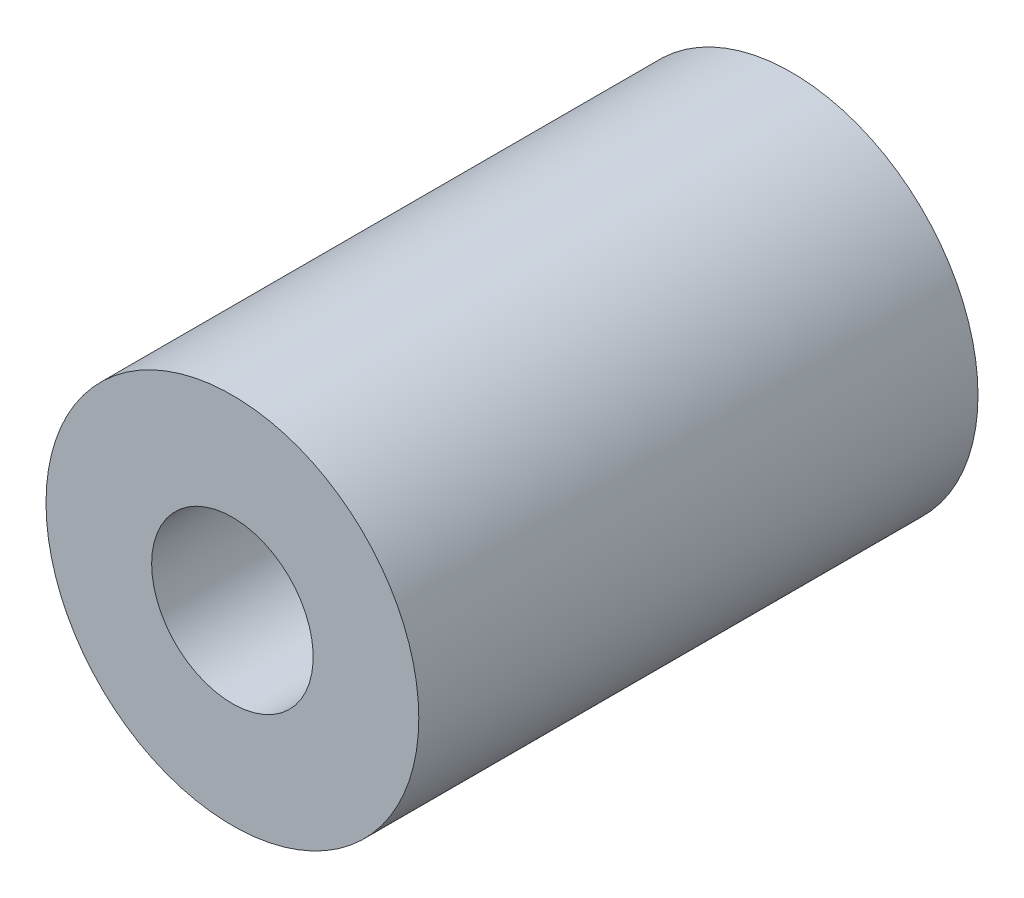
ISO-10303-21;
HEADER;
FILE_DESCRIPTION(('STEP AP214'),'2;1');
FILE_NAME('part.step','',(''),(''),'','','');
FILE_SCHEMA(('AUTOMOTIVE_DESIGN { 1 0 10303 214 1 1 1 1 }'));
ENDSEC;
DATA;
#1=APPLICATION_CONTEXT('core data for automotive mechanical design processes');
#2=APPLICATION_PROTOCOL_DEFINITION('international standard','automotive_design',2000,#1);
#3=PRODUCT_CONTEXT('',#1,'mechanical');
#4=PRODUCT('Part','Part','',(#3));
#5=PRODUCT_RELATED_PRODUCT_CATEGORY('part','',(#4));
#6=PRODUCT_DEFINITION_FORMATION('','',#4);
#7=PRODUCT_DEFINITION_CONTEXT('part definition',#1,'design');
#8=PRODUCT_DEFINITION('design','',#6,#7);
#9=PRODUCT_DEFINITION_SHAPE('','',#8);
#10=(LENGTH_UNIT() NAMED_UNIT(*) SI_UNIT(.MILLI.,.METRE.));
#11=(NAMED_UNIT(*) PLANE_ANGLE_UNIT() SI_UNIT($,.RADIAN.));
#12=(NAMED_UNIT(*) SI_UNIT($,.STERADIAN.) SOLID_ANGLE_UNIT());
#13=UNCERTAINTY_MEASURE_WITH_UNIT(LENGTH_MEASURE(1.E-05),#10,'distance_accuracy_value','');
#14=(GEOMETRIC_REPRESENTATION_CONTEXT(3) GLOBAL_UNCERTAINTY_ASSIGNED_CONTEXT((#13)) GLOBAL_UNIT_ASSIGNED_CONTEXT((#10,
#11,#12)) REPRESENTATION_CONTEXT('',''));
#15=CARTESIAN_POINT('',(0.,0.,0.));
#16=DIRECTION('',(0.,0.,1.));
#17=DIRECTION('',(1.,0.,0.));
#18=AXIS2_PLACEMENT_3D('',#15,#16,#17);
#19=CARTESIAN_POINT('',(0.,0.,22.5));
#20=DIRECTION('',(0.,0.,1.));
#21=DIRECTION('',(1.,0.,0.));
#22=AXIS2_PLACEMENT_3D('',#19,#20,#21);
#23=PLANE('',#22);
#24=CARTESIAN_POINT('',(0.,0.,22.5));
#25=DIRECTION('',(0.,0.,1.));
#26=DIRECTION('',(1.,0.,0.));
#27=AXIS2_PLACEMENT_3D('',#24,#25,#26);
#28=CIRCLE('',#27,15.);
#29=CARTESIAN_POINT('',(-15.,0.,22.5));
#30=VERTEX_POINT('',#29);
#31=EDGE_CURVE('E10',#30,#30,#28,.T.);
#32=ORIENTED_EDGE('',*,*,#31,.T.);
#33=EDGE_LOOP('',(#32));
#34=FACE_BOUND('',#33,.T.);
#35=CARTESIAN_POINT('',(0.,0.,22.5));
#36=DIRECTION('',(0.,0.,1.));
#37=DIRECTION('',(1.,0.,0.));
#38=AXIS2_PLACEMENT_3D('',#35,#36,#37);
#39=CIRCLE('',#38,6.5);
#40=CARTESIAN_POINT('',(-6.5,0.,22.5));
#41=VERTEX_POINT('',#40);
#42=EDGE_CURVE('E43',#41,#41,#39,.T.);
#43=ORIENTED_EDGE('',*,*,#42,.F.);
#44=EDGE_LOOP('',(#43));
#45=FACE_BOUND('',#44,.T.);
#46=ADVANCED_FACE('F32',(#34,#45),#23,.T.);
#47=CARTESIAN_POINT('',(0.,0.,-22.5));
#48=DIRECTION('',(0.,0.,1.));
#49=DIRECTION('',(1.,0.,0.));
#50=AXIS2_PLACEMENT_3D('',#47,#48,#49);
#51=PLANE('',#50);
#52=CARTESIAN_POINT('',(0.,0.,-22.5));
#53=DIRECTION('',(0.,0.,1.));
#54=DIRECTION('',(1.,0.,0.));
#55=AXIS2_PLACEMENT_3D('',#52,#53,#54);
#56=CIRCLE('',#55,15.);
#57=CARTESIAN_POINT('',(-15.,0.,-22.5));
#58=VERTEX_POINT('',#57);
#59=EDGE_CURVE('E36',#58,#58,#56,.T.);
#60=ORIENTED_EDGE('',*,*,#59,.F.);
#61=EDGE_LOOP('',(#60));
#62=FACE_BOUND('',#61,.T.);
#63=CARTESIAN_POINT('',(0.,0.,-22.5));
#64=DIRECTION('',(0.,0.,1.));
#65=DIRECTION('',(1.,0.,0.));
#66=AXIS2_PLACEMENT_3D('',#63,#64,#65);
#67=CIRCLE('',#66,6.5);
#68=CARTESIAN_POINT('',(-6.5,0.,-22.5));
#69=VERTEX_POINT('',#68);
#70=EDGE_CURVE('E45',#69,#69,#67,.T.);
#71=ORIENTED_EDGE('',*,*,#70,.T.);
#72=EDGE_LOOP('',(#71));
#73=FACE_BOUND('',#72,.T.);
#74=ADVANCED_FACE('F55',(#62,#73),#51,.F.);
#75=CARTESIAN_POINT('',(0.,0.,22.5));
#76=DIRECTION('',(0.,0.,-1.));
#77=DIRECTION('',(-1.,0.,0.));
#78=AXIS2_PLACEMENT_3D('',#75,#76,#77);
#79=CYLINDRICAL_SURFACE('',#78,15.);
#80=CARTESIAN_POINT('',(-15.,0.,22.5));
#81=CARTESIAN_POINT('',(-15.,0.,22.03125));
#82=CARTESIAN_POINT('',(-15.,0.,21.5625));
#83=CARTESIAN_POINT('',(-15.,0.,20.625));
#84=CARTESIAN_POINT('',(-15.,0.,20.15625));
#85=CARTESIAN_POINT('',(-15.,0.,19.21875));
#86=CARTESIAN_POINT('',(-15.,0.,18.75));
#87=CARTESIAN_POINT('',(-15.,0.,17.8125));
#88=CARTESIAN_POINT('',(-15.,0.,17.34375));
#89=CARTESIAN_POINT('',(-15.,0.,16.40625));
#90=CARTESIAN_POINT('',(-15.,0.,15.9375));
#91=CARTESIAN_POINT('',(-15.,0.,15.));
#92=CARTESIAN_POINT('',(-15.,0.,14.53125));
#93=CARTESIAN_POINT('',(-15.,0.,13.59375));
#94=CARTESIAN_POINT('',(-15.,0.,13.125));
#95=CARTESIAN_POINT('',(-15.,0.,12.1875));
#96=CARTESIAN_POINT('',(-15.,0.,11.71875));
#97=CARTESIAN_POINT('',(-15.,0.,10.78125));
#98=CARTESIAN_POINT('',(-15.,0.,10.3125));
#99=CARTESIAN_POINT('',(-15.,0.,9.37499999999999));
#100=CARTESIAN_POINT('',(-15.,0.,8.90625));
#101=CARTESIAN_POINT('',(-15.,0.,7.96874999999999));
#102=CARTESIAN_POINT('',(-15.,0.,7.5));
#103=CARTESIAN_POINT('',(-15.,0.,6.5625));
#104=CARTESIAN_POINT('',(-15.,0.,6.09375));
#105=CARTESIAN_POINT('',(-15.,0.,5.15625));
#106=CARTESIAN_POINT('',(-15.,0.,4.6875));
#107=CARTESIAN_POINT('',(-15.,0.,3.75));
#108=CARTESIAN_POINT('',(-15.,0.,3.28125));
#109=CARTESIAN_POINT('',(-15.,0.,2.34375));
#110=CARTESIAN_POINT('',(-15.,0.,1.875));
#111=CARTESIAN_POINT('',(-15.,0.,0.937499999999997));
#112=CARTESIAN_POINT('',(-15.,0.,0.468749999999997));
#113=CARTESIAN_POINT('',(-15.,0.,-0.468750000000004));
#114=CARTESIAN_POINT('',(-15.,0.,-0.937500000000004));
#115=CARTESIAN_POINT('',(-15.,0.,-1.87500000000001));
#116=CARTESIAN_POINT('',(-15.,0.,-2.34375000000001));
#117=CARTESIAN_POINT('',(-15.,0.,-3.28125));
#118=CARTESIAN_POINT('',(-15.,0.,-3.75));
#119=CARTESIAN_POINT('',(-15.,0.,-4.6875));
#120=CARTESIAN_POINT('',(-15.,0.,-5.15625));
#121=CARTESIAN_POINT('',(-15.,0.,-6.09375000000001));
#122=CARTESIAN_POINT('',(-15.,0.,-6.56250000000001));
#123=CARTESIAN_POINT('',(-15.,0.,-7.50000000000001));
#124=CARTESIAN_POINT('',(-15.,0.,-7.96875000000001));
#125=CARTESIAN_POINT('',(-15.,0.,-8.90625));
#126=CARTESIAN_POINT('',(-15.,0.,-9.37500000000001));
#127=CARTESIAN_POINT('',(-15.,0.,-10.3125));
#128=CARTESIAN_POINT('',(-15.,0.,-10.78125));
#129=CARTESIAN_POINT('',(-15.,0.,-11.71875));
#130=CARTESIAN_POINT('',(-15.,0.,-12.1875));
#131=CARTESIAN_POINT('',(-15.,0.,-13.125));
#132=CARTESIAN_POINT('',(-15.,0.,-13.59375));
#133=CARTESIAN_POINT('',(-15.,0.,-14.53125));
#134=CARTESIAN_POINT('',(-15.,0.,-15.));
#135=CARTESIAN_POINT('',(-15.,0.,-15.9375));
#136=CARTESIAN_POINT('',(-15.,0.,-16.40625));
#137=CARTESIAN_POINT('',(-15.,0.,-17.34375));
#138=CARTESIAN_POINT('',(-15.,0.,-17.8125));
#139=CARTESIAN_POINT('',(-15.,0.,-18.75));
#140=CARTESIAN_POINT('',(-15.,0.,-19.21875));
#141=CARTESIAN_POINT('',(-15.,0.,-20.15625));
#142=CARTESIAN_POINT('',(-15.,0.,-20.625));
#143=CARTESIAN_POINT('',(-15.,0.,-21.5625));
#144=CARTESIAN_POINT('',(-15.,0.,-22.03125));
#145=CARTESIAN_POINT('',(-15.,0.,-22.5));
#146=B_SPLINE_CURVE_WITH_KNOTS('',3,(#80,#81,#82,#83,#84,#85,#86,#87,#88,#89,#90,#91,#92,#93,
#94,#95,#96,#97,#98,#99,#100,#101,#102,#103,#104,#105,#106,#107,#108,#109,#110,#111,#112,#113,
#114,#115,#116,#117,#118,#119,#120,#121,#122,#123,#124,#125,#126,#127,#128,#129,#130,#131,#132,
#133,#134,#135,#136,#137,#138,#139,#140,#141,#142,#143,#144,#145),.UNSPECIFIED.,.F.,.F.,(4,2,2,
2,2,2,2,2,2,2,2,2,2,2,2,2,2,2,2,2,2,2,2,2,2,2,2,2,2,2,2,2,4),(0.,1.40625,2.8125,4.21875,5.625,
7.03125,8.4375,9.84375,11.25,12.65625,14.0625,15.46875,16.875,18.28125,19.6875,21.09375,22.5,
23.90625,25.3125,26.71875,28.125,29.53125,30.9375,32.34375,33.75,35.15625,36.5625,37.96875,
39.375,40.78125,42.1875,43.59375,45.),.UNSPECIFIED.);
#147=EDGE_CURVE('BSEAM34',#30,#58,#146,.T.);
#148=ORIENTED_EDGE('',*,*,#31,.F.);
#149=ORIENTED_EDGE('',*,*,#59,.T.);
#150=ORIENTED_EDGE('',*,*,#147,.T.);
#151=ORIENTED_EDGE('',*,*,#147,.F.);
#152=EDGE_LOOP('',(#148,#150,#149,#151));
#153=FACE_BOUND('',#152,.T.);
#154=ADVANCED_FACE('F34',(#153),#79,.T.);
#155=CARTESIAN_POINT('',(0.,0.,22.5));
#156=DIRECTION('',(0.,0.,-1.));
#157=DIRECTION('',(-1.,0.,0.));
#158=AXIS2_PLACEMENT_3D('',#155,#156,#157);
#159=CYLINDRICAL_SURFACE('',#158,6.5);
#160=CARTESIAN_POINT('',(-6.5,0.,22.5));
#161=CARTESIAN_POINT('',(-6.5,0.,22.03125));
#162=CARTESIAN_POINT('',(-6.5,0.,21.5625));
#163=CARTESIAN_POINT('',(-6.5,0.,20.625));
#164=CARTESIAN_POINT('',(-6.5,0.,20.15625));
#165=CARTESIAN_POINT('',(-6.5,0.,19.21875));
#166=CARTESIAN_POINT('',(-6.5,0.,18.75));
#167=CARTESIAN_POINT('',(-6.5,0.,17.8125));
#168=CARTESIAN_POINT('',(-6.5,0.,17.34375));
#169=CARTESIAN_POINT('',(-6.5,0.,16.40625));
#170=CARTESIAN_POINT('',(-6.5,0.,15.9375));
#171=CARTESIAN_POINT('',(-6.5,0.,15.));
#172=CARTESIAN_POINT('',(-6.5,0.,14.53125));
#173=CARTESIAN_POINT('',(-6.5,0.,13.59375));
#174=CARTESIAN_POINT('',(-6.5,0.,13.125));
#175=CARTESIAN_POINT('',(-6.5,0.,12.1875));
#176=CARTESIAN_POINT('',(-6.5,0.,11.71875));
#177=CARTESIAN_POINT('',(-6.5,0.,10.78125));
#178=CARTESIAN_POINT('',(-6.5,0.,10.3125));
#179=CARTESIAN_POINT('',(-6.5,0.,9.37499999999999));
#180=CARTESIAN_POINT('',(-6.5,0.,8.90625));
#181=CARTESIAN_POINT('',(-6.5,0.,7.96874999999999));
#182=CARTESIAN_POINT('',(-6.5,0.,7.5));
#183=CARTESIAN_POINT('',(-6.5,0.,6.5625));
#184=CARTESIAN_POINT('',(-6.5,0.,6.09374999999999));
#185=CARTESIAN_POINT('',(-6.5,0.,5.15624999999999));
#186=CARTESIAN_POINT('',(-6.5,0.,4.68749999999999));
#187=CARTESIAN_POINT('',(-6.5,0.,3.74999999999999));
#188=CARTESIAN_POINT('',(-6.5,0.,3.28124999999999));
#189=CARTESIAN_POINT('',(-6.5,0.,2.34375));
#190=CARTESIAN_POINT('',(-6.5,0.,1.87499999999999));
#191=CARTESIAN_POINT('',(-6.5,0.,0.937499999999994));
#192=CARTESIAN_POINT('',(-6.5,0.,0.468749999999993));
#193=CARTESIAN_POINT('',(-6.5,0.,-0.468750000000007));
#194=CARTESIAN_POINT('',(-6.5,0.,-0.937500000000008));
#195=CARTESIAN_POINT('',(-6.5,0.,-1.87500000000001));
#196=CARTESIAN_POINT('',(-6.5,0.,-2.34375000000001));
#197=CARTESIAN_POINT('',(-6.5,0.,-3.28125000000001));
#198=CARTESIAN_POINT('',(-6.5,0.,-3.75000000000001));
#199=CARTESIAN_POINT('',(-6.5,0.,-4.68750000000001));
#200=CARTESIAN_POINT('',(-6.5,0.,-5.15625000000001));
#201=CARTESIAN_POINT('',(-6.5,0.,-6.09375000000001));
#202=CARTESIAN_POINT('',(-6.5,0.,-6.56250000000001));
#203=CARTESIAN_POINT('',(-6.5,0.,-7.50000000000001));
#204=CARTESIAN_POINT('',(-6.5,0.,-7.96875000000001));
#205=CARTESIAN_POINT('',(-6.5,0.,-8.90625000000001));
#206=CARTESIAN_POINT('',(-6.5,0.,-9.37500000000001));
#207=CARTESIAN_POINT('',(-6.5,0.,-10.3125));
#208=CARTESIAN_POINT('',(-6.5,0.,-10.78125));
#209=CARTESIAN_POINT('',(-6.5,0.,-11.71875));
#210=CARTESIAN_POINT('',(-6.5,0.,-12.1875));
#211=CARTESIAN_POINT('',(-6.5,0.,-13.125));
#212=CARTESIAN_POINT('',(-6.5,0.,-13.59375));
#213=CARTESIAN_POINT('',(-6.5,0.,-14.53125));
#214=CARTESIAN_POINT('',(-6.5,0.,-15.));
#215=CARTESIAN_POINT('',(-6.5,0.,-15.9375));
#216=CARTESIAN_POINT('',(-6.5,0.,-16.40625));
#217=CARTESIAN_POINT('',(-6.5,0.,-17.34375));
#218=CARTESIAN_POINT('',(-6.5,0.,-17.8125));
#219=CARTESIAN_POINT('',(-6.5,0.,-18.75));
#220=CARTESIAN_POINT('',(-6.5,0.,-19.21875));
#221=CARTESIAN_POINT('',(-6.5,0.,-20.15625));
#222=CARTESIAN_POINT('',(-6.5,0.,-20.625));
#223=CARTESIAN_POINT('',(-6.5,0.,-21.5625));
#224=CARTESIAN_POINT('',(-6.5,0.,-22.03125));
#225=CARTESIAN_POINT('',(-6.5,0.,-22.5));
#226=B_SPLINE_CURVE_WITH_KNOTS('',3,(#160,#161,#162,#163,#164,#165,#166,#167,#168,#169,#170,
#171,#172,#173,#174,#175,#176,#177,#178,#179,#180,#181,#182,#183,#184,#185,#186,#187,#188,#189,
#190,#191,#192,#193,#194,#195,#196,#197,#198,#199,#200,#201,#202,#203,#204,#205,#206,#207,#208,
#209,#210,#211,#212,#213,#214,#215,#216,#217,#218,#219,#220,#221,#222,#223,#224,#225),
.UNSPECIFIED.,.F.,.F.,(4,2,2,2,2,2,2,2,2,2,2,2,2,2,2,2,2,2,2,2,2,2,2,2,2,2,2,2,2,2,2,2,4),(0.,
1.40625,2.8125,4.21875,5.625,7.03125,8.4375,9.84375,11.25,12.65625,14.0625,15.46875,16.875,
18.28125,19.6875,21.09375,22.5,23.90625,25.3125,26.71875,28.125,29.53125,30.9375,32.34375,33.75,
35.15625,36.5625,37.96875,39.375,40.78125,42.1875,43.59375,45.),.UNSPECIFIED.);
#227=EDGE_CURVE('BSEAM51',#41,#69,#226,.T.);
#228=ORIENTED_EDGE('',*,*,#42,.T.);
#229=ORIENTED_EDGE('',*,*,#70,.F.);
#230=ORIENTED_EDGE('',*,*,#227,.T.);
#231=ORIENTED_EDGE('',*,*,#227,.F.);
#232=EDGE_LOOP('',(#228,#230,#229,#231));
#233=FACE_BOUND('',#232,.T.);
#234=ADVANCED_FACE('F51',(#233),#159,.F.);
#235=CLOSED_SHELL('',(#46,#74,#154,#234));
#236=MANIFOLD_SOLID_BREP('B2',#235);
#237=ADVANCED_BREP_SHAPE_REPRESENTATION('',(#18,#236),#14);
#238=SHAPE_DEFINITION_REPRESENTATION(#9,#237);
ENDSEC;
END-ISO-10303-21;
